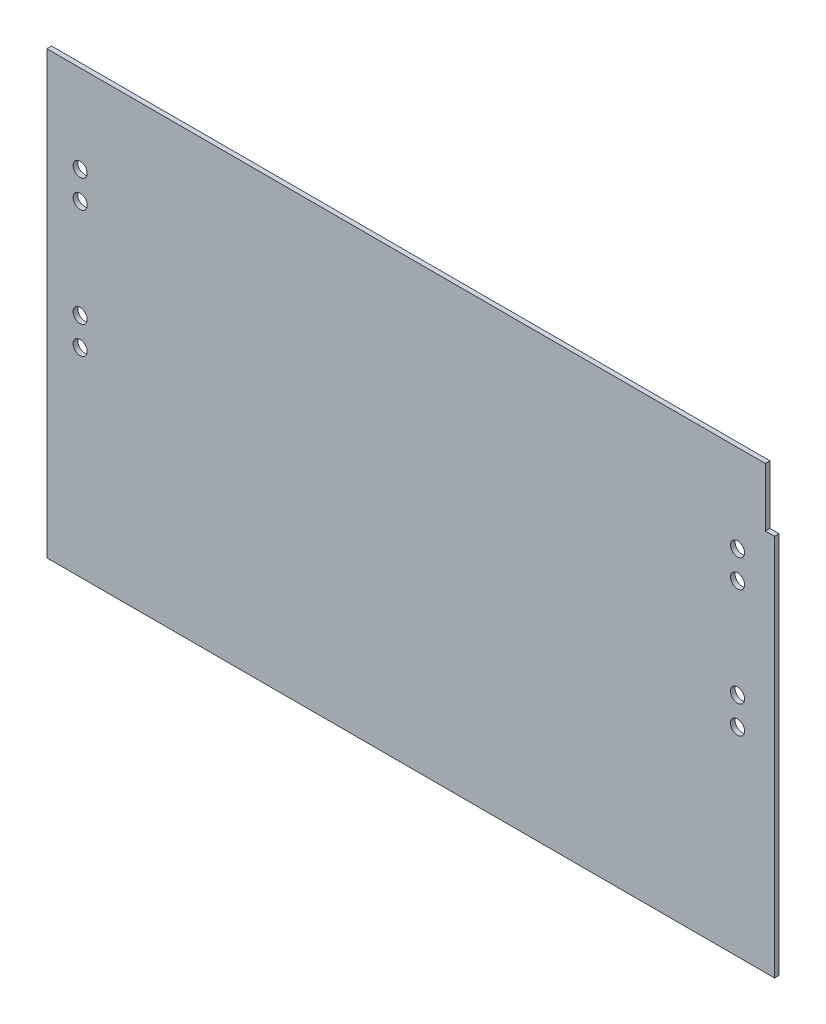
ISO-10303-21;
HEADER;
FILE_DESCRIPTION(('STEP AP214'),'2;1');
FILE_NAME('part.step','',(''),(''),'','','');
FILE_SCHEMA(('AUTOMOTIVE_DESIGN { 1 0 10303 214 1 1 1 1 }'));
ENDSEC;
DATA;
#1=APPLICATION_CONTEXT('core data for automotive mechanical design processes');
#2=APPLICATION_PROTOCOL_DEFINITION('international standard','automotive_design',2000,#1);
#3=PRODUCT_CONTEXT('',#1,'mechanical');
#4=PRODUCT('Part','Part','',(#3));
#5=PRODUCT_RELATED_PRODUCT_CATEGORY('part','',(#4));
#6=PRODUCT_DEFINITION_FORMATION('','',#4);
#7=PRODUCT_DEFINITION_CONTEXT('part definition',#1,'design');
#8=PRODUCT_DEFINITION('design','',#6,#7);
#9=PRODUCT_DEFINITION_SHAPE('','',#8);
#10=(LENGTH_UNIT() NAMED_UNIT(*) SI_UNIT(.MILLI.,.METRE.));
#11=(NAMED_UNIT(*) PLANE_ANGLE_UNIT() SI_UNIT($,.RADIAN.));
#12=(NAMED_UNIT(*) SI_UNIT($,.STERADIAN.) SOLID_ANGLE_UNIT());
#13=UNCERTAINTY_MEASURE_WITH_UNIT(LENGTH_MEASURE(1.E-05),#10,'distance_accuracy_value','');
#14=(GEOMETRIC_REPRESENTATION_CONTEXT(3) GLOBAL_UNCERTAINTY_ASSIGNED_CONTEXT((#13)) GLOBAL_UNIT_ASSIGNED_CONTEXT((#10,
#11,#12)) REPRESENTATION_CONTEXT('',''));
#15=CARTESIAN_POINT('',(0.,0.,0.));
#16=DIRECTION('',(0.,0.,1.));
#17=DIRECTION('',(1.,0.,0.));
#18=AXIS2_PLACEMENT_3D('',#15,#16,#17);
#19=CARTESIAN_POINT('',(0.,0.,3.175));
#20=DIRECTION('',(0.,0.,1.));
#21=DIRECTION('',(1.,0.,0.));
#22=AXIS2_PLACEMENT_3D('',#19,#20,#21);
#23=PLANE('',#22);
#24=CARTESIAN_POINT('',(224.4725,91.1225,3.175));
#25=DIRECTION('',(0.,0.,1.));
#26=DIRECTION('',(1.,0.,0.));
#27=AXIS2_PLACEMENT_3D('',#24,#25,#26);
#28=CIRCLE('',#27,4.82599999999999);
#29=CARTESIAN_POINT('',(229.2985,91.1225,3.175));
#30=VERTEX_POINT('',#29);
#31=EDGE_CURVE('E180',#30,#30,#28,.T.);
#32=ORIENTED_EDGE('',*,*,#31,.F.);
#33=EDGE_LOOP('',(#32));
#34=FACE_BOUND('',#33,.T.);
#35=CARTESIAN_POINT('',(224.4725,-14.9225,3.175));
#36=DIRECTION('',(0.,0.,1.));
#37=DIRECTION('',(1.,0.,0.));
#38=AXIS2_PLACEMENT_3D('',#35,#36,#37);
#39=CIRCLE('',#38,4.82599999999999);
#40=CARTESIAN_POINT('',(229.2985,-14.9225,3.175));
#41=VERTEX_POINT('',#40);
#42=EDGE_CURVE('E168',#41,#41,#39,.T.);
#43=ORIENTED_EDGE('',*,*,#42,.F.);
#44=EDGE_LOOP('',(#43));
#45=FACE_BOUND('',#44,.T.);
#46=CARTESIAN_POINT('',(-227.0125,91.1225,3.175));
#47=DIRECTION('',(0.,0.,1.));
#48=DIRECTION('',(1.,0.,0.));
#49=AXIS2_PLACEMENT_3D('',#46,#47,#48);
#50=CIRCLE('',#49,4.82599999999999);
#51=CARTESIAN_POINT('',(-222.1865,91.1225,3.175));
#52=VERTEX_POINT('',#51);
#53=EDGE_CURVE('E156',#52,#52,#50,.T.);
#54=ORIENTED_EDGE('',*,*,#53,.F.);
#55=EDGE_LOOP('',(#54));
#56=FACE_BOUND('',#55,.T.);
#57=CARTESIAN_POINT('',(-227.0125,-14.9225,3.175));
#58=DIRECTION('',(0.,0.,1.));
#59=DIRECTION('',(1.,0.,0.));
#60=AXIS2_PLACEMENT_3D('',#57,#58,#59);
#61=CIRCLE('',#60,4.82599999999999);
#62=CARTESIAN_POINT('',(-222.1865,-14.9225,3.175));
#63=VERTEX_POINT('',#62);
#64=EDGE_CURVE('E120',#63,#63,#61,.T.);
#65=ORIENTED_EDGE('',*,*,#64,.F.);
#66=EDGE_LOOP('',(#65));
#67=FACE_BOUND('',#66,.T.);
#68=DIRECTION('',(0.,1.,0.));
#69=VECTOR('',#68,1.);
#70=CARTESIAN_POINT('',(249.8725,-151.4475,3.175));
#71=LINE('',#70,#69);
#72=CARTESIAN_POINT('',(249.8725,-151.4475,3.175));
#73=VERTEX_POINT('',#72);
#74=CARTESIAN_POINT('',(249.8725,111.2647,3.175));
#75=VERTEX_POINT('',#74);
#76=EDGE_CURVE('E81',#73,#75,#71,.T.);
#77=ORIENTED_EDGE('',*,*,#76,.T.);
#78=DIRECTION('',(-1.,0.,0.));
#79=VECTOR('',#78,1.);
#80=CARTESIAN_POINT('',(249.8725,111.2647,3.175));
#81=LINE('',#80,#79);
#82=CARTESIAN_POINT('',(243.5225,111.2647,3.175));
#83=VERTEX_POINT('',#82);
#84=EDGE_CURVE('E143',#75,#83,#81,.T.);
#85=ORIENTED_EDGE('',*,*,#84,.T.);
#86=DIRECTION('',(0.,1.,0.));
#87=VECTOR('',#86,1.);
#88=CARTESIAN_POINT('',(243.5225,151.4475,3.175));
#89=LINE('',#88,#87);
#90=CARTESIAN_POINT('',(243.5225,151.4475,3.175));
#91=VERTEX_POINT('',#90);
#92=EDGE_CURVE('E96',#83,#91,#89,.T.);
#93=ORIENTED_EDGE('',*,*,#92,.T.);
#94=DIRECTION('',(-1.,0.,0.));
#95=VECTOR('',#94,1.);
#96=CARTESIAN_POINT('',(-249.8725,151.4475,3.175));
#97=LINE('',#96,#95);
#98=CARTESIAN_POINT('',(-249.8725,151.4475,3.175));
#99=VERTEX_POINT('',#98);
#100=EDGE_CURVE('E89',#91,#99,#97,.T.);
#101=ORIENTED_EDGE('',*,*,#100,.T.);
#102=DIRECTION('',(0.,-1.,0.));
#103=VECTOR('',#102,1.);
#104=CARTESIAN_POINT('',(-249.8725,-120.9675,3.175));
#105=LINE('',#104,#103);
#106=CARTESIAN_POINT('',(-249.8725,-151.4475,3.175));
#107=VERTEX_POINT('',#106);
#108=EDGE_CURVE('E93',#99,#107,#105,.T.);
#109=ORIENTED_EDGE('',*,*,#108,.T.);
#110=DIRECTION('',(1.,0.,0.));
#111=VECTOR('',#110,1.);
#112=CARTESIAN_POINT('',(-249.8725,-151.4475,3.175));
#113=LINE('',#112,#111);
#114=EDGE_CURVE('E50',#107,#73,#113,.T.);
#115=ORIENTED_EDGE('',*,*,#114,.T.);
#116=EDGE_LOOP('',(#77,#85,#93,#101,#109,#115));
#117=FACE_BOUND('',#116,.T.);
#118=CARTESIAN_POINT('',(-227.0125,4.12749999999997,3.175));
#119=DIRECTION('',(0.,0.,1.));
#120=DIRECTION('',(1.,0.,0.));
#121=AXIS2_PLACEMENT_3D('',#118,#119,#120);
#122=CIRCLE('',#121,4.82599999999999);
#123=CARTESIAN_POINT('',(-222.1865,4.12749999999997,3.175));
#124=VERTEX_POINT('',#123);
#125=EDGE_CURVE('E150',#124,#124,#122,.T.);
#126=ORIENTED_EDGE('',*,*,#125,.F.);
#127=EDGE_LOOP('',(#126));
#128=FACE_BOUND('',#127,.T.);
#129=CARTESIAN_POINT('',(-227.0125,72.0725,3.175));
#130=DIRECTION('',(0.,0.,1.));
#131=DIRECTION('',(1.,0.,0.));
#132=AXIS2_PLACEMENT_3D('',#129,#130,#131);
#133=CIRCLE('',#132,4.82599999999999);
#134=CARTESIAN_POINT('',(-222.1865,72.0725,3.175));
#135=VERTEX_POINT('',#134);
#136=EDGE_CURVE('E162',#135,#135,#133,.T.);
#137=ORIENTED_EDGE('',*,*,#136,.F.);
#138=EDGE_LOOP('',(#137));
#139=FACE_BOUND('',#138,.T.);
#140=CARTESIAN_POINT('',(224.4725,4.12749999999997,3.175));
#141=DIRECTION('',(0.,0.,1.));
#142=DIRECTION('',(1.,0.,0.));
#143=AXIS2_PLACEMENT_3D('',#140,#141,#142);
#144=CIRCLE('',#143,4.82599999999999);
#145=CARTESIAN_POINT('',(229.2985,4.12749999999997,3.175));
#146=VERTEX_POINT('',#145);
#147=EDGE_CURVE('E174',#146,#146,#144,.T.);
#148=ORIENTED_EDGE('',*,*,#147,.F.);
#149=EDGE_LOOP('',(#148));
#150=FACE_BOUND('',#149,.T.);
#151=CARTESIAN_POINT('',(224.4725,72.0725,3.175));
#152=DIRECTION('',(0.,0.,1.));
#153=DIRECTION('',(1.,0.,0.));
#154=AXIS2_PLACEMENT_3D('',#151,#152,#153);
#155=CIRCLE('',#154,4.82599999999999);
#156=CARTESIAN_POINT('',(229.2985,72.0725,3.175));
#157=VERTEX_POINT('',#156);
#158=EDGE_CURVE('E186',#157,#157,#155,.T.);
#159=ORIENTED_EDGE('',*,*,#158,.F.);
#160=EDGE_LOOP('',(#159));
#161=FACE_BOUND('',#160,.T.);
#162=ADVANCED_FACE('F33',(#34,#45,#56,#67,#117,#128,#139,#150,#161),#23,.T.);
#163=CARTESIAN_POINT('',(0.,0.,0.));
#164=DIRECTION('',(0.,0.,1.));
#165=DIRECTION('',(1.,0.,0.));
#166=AXIS2_PLACEMENT_3D('',#163,#164,#165);
#167=PLANE('',#166);
#168=DIRECTION('',(0.,1.,0.));
#169=VECTOR('',#168,1.);
#170=CARTESIAN_POINT('',(249.8725,-120.9675,0.));
#171=LINE('',#170,#169);
#172=CARTESIAN_POINT('',(249.8725,-151.4475,0.));
#173=VERTEX_POINT('',#172);
#174=CARTESIAN_POINT('',(249.8725,111.2647,0.));
#175=VERTEX_POINT('',#174);
#176=EDGE_CURVE('E76',#173,#175,#171,.T.);
#177=ORIENTED_EDGE('',*,*,#176,.F.);
#178=DIRECTION('',(1.,0.,0.));
#179=VECTOR('',#178,1.);
#180=CARTESIAN_POINT('',(211.7725,-151.4475,0.));
#181=LINE('',#180,#179);
#182=CARTESIAN_POINT('',(-249.8725,-151.4475,0.));
#183=VERTEX_POINT('',#182);
#184=EDGE_CURVE('E72',#183,#173,#181,.T.);
#185=ORIENTED_EDGE('',*,*,#184,.F.);
#186=DIRECTION('',(0.,-1.,0.));
#187=VECTOR('',#186,1.);
#188=CARTESIAN_POINT('',(-249.8725,-120.9675,0.));
#189=LINE('',#188,#187);
#190=CARTESIAN_POINT('',(-249.8725,151.4475,0.));
#191=VERTEX_POINT('',#190);
#192=EDGE_CURVE('E125',#191,#183,#189,.T.);
#193=ORIENTED_EDGE('',*,*,#192,.F.);
#194=DIRECTION('',(-1.,0.,0.));
#195=VECTOR('',#194,1.);
#196=CARTESIAN_POINT('',(-249.8725,151.4475,0.));
#197=LINE('',#196,#195);
#198=CARTESIAN_POINT('',(243.5225,151.4475,0.));
#199=VERTEX_POINT('',#198);
#200=EDGE_CURVE('E106',#199,#191,#197,.T.);
#201=ORIENTED_EDGE('',*,*,#200,.F.);
#202=DIRECTION('',(0.,1.,0.));
#203=VECTOR('',#202,1.);
#204=CARTESIAN_POINT('',(243.5225,151.4475,0.));
#205=LINE('',#204,#203);
#206=CARTESIAN_POINT('',(243.5225,111.2647,0.));
#207=VERTEX_POINT('',#206);
#208=EDGE_CURVE('E122',#207,#199,#205,.T.);
#209=ORIENTED_EDGE('',*,*,#208,.F.);
#210=DIRECTION('',(-1.,0.,0.));
#211=VECTOR('',#210,1.);
#212=CARTESIAN_POINT('',(249.8725,111.2647,0.));
#213=LINE('',#212,#211);
#214=EDGE_CURVE('E119',#175,#207,#213,.T.);
#215=ORIENTED_EDGE('',*,*,#214,.F.);
#216=EDGE_LOOP('',(#177,#185,#193,#201,#209,#215));
#217=FACE_BOUND('',#216,.T.);
#218=CARTESIAN_POINT('',(-227.0125,-14.9225,0.));
#219=DIRECTION('',(0.,0.,1.));
#220=DIRECTION('',(1.,0.,0.));
#221=AXIS2_PLACEMENT_3D('',#218,#219,#220);
#222=CIRCLE('',#221,4.82599999999999);
#223=CARTESIAN_POINT('',(-222.1865,-14.9225,0.));
#224=VERTEX_POINT('',#223);
#225=EDGE_CURVE('E147',#224,#224,#222,.T.);
#226=ORIENTED_EDGE('',*,*,#225,.T.);
#227=EDGE_LOOP('',(#226));
#228=FACE_BOUND('',#227,.T.);
#229=CARTESIAN_POINT('',(-227.0125,4.12749999999997,0.));
#230=DIRECTION('',(0.,0.,1.));
#231=DIRECTION('',(1.,0.,0.));
#232=AXIS2_PLACEMENT_3D('',#229,#230,#231);
#233=CIRCLE('',#232,4.82599999999999);
#234=CARTESIAN_POINT('',(-222.1865,4.12749999999997,0.));
#235=VERTEX_POINT('',#234);
#236=EDGE_CURVE('E153',#235,#235,#233,.T.);
#237=ORIENTED_EDGE('',*,*,#236,.T.);
#238=EDGE_LOOP('',(#237));
#239=FACE_BOUND('',#238,.T.);
#240=CARTESIAN_POINT('',(-227.0125,91.1225,0.));
#241=DIRECTION('',(0.,0.,1.));
#242=DIRECTION('',(1.,0.,0.));
#243=AXIS2_PLACEMENT_3D('',#240,#241,#242);
#244=CIRCLE('',#243,4.82599999999999);
#245=CARTESIAN_POINT('',(-222.1865,91.1225,0.));
#246=VERTEX_POINT('',#245);
#247=EDGE_CURVE('E159',#246,#246,#244,.T.);
#248=ORIENTED_EDGE('',*,*,#247,.T.);
#249=EDGE_LOOP('',(#248));
#250=FACE_BOUND('',#249,.T.);
#251=CARTESIAN_POINT('',(-227.0125,72.0725,0.));
#252=DIRECTION('',(0.,0.,1.));
#253=DIRECTION('',(1.,0.,0.));
#254=AXIS2_PLACEMENT_3D('',#251,#252,#253);
#255=CIRCLE('',#254,4.82599999999999);
#256=CARTESIAN_POINT('',(-222.1865,72.0725,0.));
#257=VERTEX_POINT('',#256);
#258=EDGE_CURVE('E165',#257,#257,#255,.T.);
#259=ORIENTED_EDGE('',*,*,#258,.T.);
#260=EDGE_LOOP('',(#259));
#261=FACE_BOUND('',#260,.T.);
#262=CARTESIAN_POINT('',(224.4725,-14.9225,0.));
#263=DIRECTION('',(0.,0.,1.));
#264=DIRECTION('',(1.,0.,0.));
#265=AXIS2_PLACEMENT_3D('',#262,#263,#264);
#266=CIRCLE('',#265,4.82599999999999);
#267=CARTESIAN_POINT('',(229.2985,-14.9225,0.));
#268=VERTEX_POINT('',#267);
#269=EDGE_CURVE('E171',#268,#268,#266,.T.);
#270=ORIENTED_EDGE('',*,*,#269,.T.);
#271=EDGE_LOOP('',(#270));
#272=FACE_BOUND('',#271,.T.);
#273=CARTESIAN_POINT('',(224.4725,4.12749999999997,0.));
#274=DIRECTION('',(0.,0.,1.));
#275=DIRECTION('',(1.,0.,0.));
#276=AXIS2_PLACEMENT_3D('',#273,#274,#275);
#277=CIRCLE('',#276,4.82599999999999);
#278=CARTESIAN_POINT('',(229.2985,4.12749999999997,0.));
#279=VERTEX_POINT('',#278);
#280=EDGE_CURVE('E177',#279,#279,#277,.T.);
#281=ORIENTED_EDGE('',*,*,#280,.T.);
#282=EDGE_LOOP('',(#281));
#283=FACE_BOUND('',#282,.T.);
#284=CARTESIAN_POINT('',(224.4725,91.1225,0.));
#285=DIRECTION('',(0.,0.,1.));
#286=DIRECTION('',(1.,0.,0.));
#287=AXIS2_PLACEMENT_3D('',#284,#285,#286);
#288=CIRCLE('',#287,4.82599999999999);
#289=CARTESIAN_POINT('',(229.2985,91.1225,0.));
#290=VERTEX_POINT('',#289);
#291=EDGE_CURVE('E183',#290,#290,#288,.T.);
#292=ORIENTED_EDGE('',*,*,#291,.T.);
#293=EDGE_LOOP('',(#292));
#294=FACE_BOUND('',#293,.T.);
#295=CARTESIAN_POINT('',(224.4725,72.0725,0.));
#296=DIRECTION('',(0.,0.,1.));
#297=DIRECTION('',(1.,0.,0.));
#298=AXIS2_PLACEMENT_3D('',#295,#296,#297);
#299=CIRCLE('',#298,4.82599999999999);
#300=CARTESIAN_POINT('',(229.2985,72.0725,0.));
#301=VERTEX_POINT('',#300);
#302=EDGE_CURVE('E189',#301,#301,#299,.T.);
#303=ORIENTED_EDGE('',*,*,#302,.T.);
#304=EDGE_LOOP('',(#303));
#305=FACE_BOUND('',#304,.T.);
#306=ADVANCED_FACE('F138',(#217,#228,#239,#250,#261,#272,#283,#294,#305),#167,.F.);
#307=CARTESIAN_POINT('',(249.8725,-120.9675,3.175));
#308=DIRECTION('',(-1.,0.,0.));
#309=DIRECTION('',(0.,0.,1.));
#310=AXIS2_PLACEMENT_3D('',#307,#308,#309);
#311=PLANE('',#310);
#312=ORIENTED_EDGE('',*,*,#176,.T.);
#313=DIRECTION('',(0.,0.,-1.));
#314=VECTOR('',#313,1.);
#315=CARTESIAN_POINT('',(249.8725,111.2647,3.175));
#316=LINE('',#315,#314);
#317=EDGE_CURVE('E11',#75,#175,#316,.T.);
#318=ORIENTED_EDGE('',*,*,#317,.F.);
#319=ORIENTED_EDGE('',*,*,#76,.F.);
#320=DIRECTION('',(0.,0.,-1.));
#321=VECTOR('',#320,1.);
#322=CARTESIAN_POINT('',(249.8725,-151.4475,3.175));
#323=LINE('',#322,#321);
#324=EDGE_CURVE('E114',#73,#173,#323,.T.);
#325=ORIENTED_EDGE('',*,*,#324,.T.);
#326=EDGE_LOOP('',(#312,#318,#319,#325));
#327=FACE_BOUND('',#326,.T.);
#328=ADVANCED_FACE('F35',(#327),#311,.F.);
#329=CARTESIAN_POINT('',(249.8725,111.2647,3.175));
#330=DIRECTION('',(0.,-1.,0.));
#331=DIRECTION('',(0.,0.,-1.));
#332=AXIS2_PLACEMENT_3D('',#329,#330,#331);
#333=PLANE('',#332);
#334=ORIENTED_EDGE('',*,*,#214,.T.);
#335=DIRECTION('',(0.,0.,-1.));
#336=VECTOR('',#335,1.);
#337=CARTESIAN_POINT('',(243.5225,111.2647,3.175));
#338=LINE('',#337,#336);
#339=EDGE_CURVE('E42',#83,#207,#338,.T.);
#340=ORIENTED_EDGE('',*,*,#339,.F.);
#341=ORIENTED_EDGE('',*,*,#84,.F.);
#342=ORIENTED_EDGE('',*,*,#317,.T.);
#343=EDGE_LOOP('',(#334,#340,#341,#342));
#344=FACE_BOUND('',#343,.T.);
#345=ADVANCED_FACE('F218',(#344),#333,.F.);
#346=CARTESIAN_POINT('',(243.5225,151.4475,3.175));
#347=DIRECTION('',(-1.,0.,0.));
#348=DIRECTION('',(0.,-1.,0.));
#349=AXIS2_PLACEMENT_3D('',#346,#347,#348);
#350=PLANE('',#349);
#351=ORIENTED_EDGE('',*,*,#208,.T.);
#352=DIRECTION('',(0.,0.,-1.));
#353=VECTOR('',#352,1.);
#354=CARTESIAN_POINT('',(243.5225,151.4475,3.175));
#355=LINE('',#354,#353);
#356=EDGE_CURVE('E108',#91,#199,#355,.T.);
#357=ORIENTED_EDGE('',*,*,#356,.F.);
#358=ORIENTED_EDGE('',*,*,#92,.F.);
#359=ORIENTED_EDGE('',*,*,#339,.T.);
#360=EDGE_LOOP('',(#351,#357,#358,#359));
#361=FACE_BOUND('',#360,.T.);
#362=ADVANCED_FACE('F135',(#361),#350,.F.);
#363=CARTESIAN_POINT('',(-249.8725,151.4475,3.175));
#364=DIRECTION('',(0.,-1.,0.));
#365=DIRECTION('',(0.,0.,-1.));
#366=AXIS2_PLACEMENT_3D('',#363,#364,#365);
#367=PLANE('',#366);
#368=ORIENTED_EDGE('',*,*,#200,.T.);
#369=DIRECTION('',(0.,0.,-1.));
#370=VECTOR('',#369,1.);
#371=CARTESIAN_POINT('',(-249.8725,151.4475,3.175));
#372=LINE('',#371,#370);
#373=EDGE_CURVE('E103',#99,#191,#372,.T.);
#374=ORIENTED_EDGE('',*,*,#373,.F.);
#375=ORIENTED_EDGE('',*,*,#100,.F.);
#376=ORIENTED_EDGE('',*,*,#356,.T.);
#377=EDGE_LOOP('',(#368,#374,#375,#376));
#378=FACE_BOUND('',#377,.T.);
#379=ADVANCED_FACE('F104',(#378),#367,.F.);
#380=CARTESIAN_POINT('',(-249.8725,-120.9675,3.175));
#381=DIRECTION('',(1.,0.,0.));
#382=DIRECTION('',(0.,0.,-1.));
#383=AXIS2_PLACEMENT_3D('',#380,#381,#382);
#384=PLANE('',#383);
#385=ORIENTED_EDGE('',*,*,#192,.T.);
#386=DIRECTION('',(0.,0.,-1.));
#387=VECTOR('',#386,1.);
#388=CARTESIAN_POINT('',(-249.8725,-151.4475,3.175));
#389=LINE('',#388,#387);
#390=EDGE_CURVE('E109',#107,#183,#389,.T.);
#391=ORIENTED_EDGE('',*,*,#390,.F.);
#392=ORIENTED_EDGE('',*,*,#108,.F.);
#393=ORIENTED_EDGE('',*,*,#373,.T.);
#394=EDGE_LOOP('',(#385,#391,#392,#393));
#395=FACE_BOUND('',#394,.T.);
#396=ADVANCED_FACE('F111',(#395),#384,.F.);
#397=CARTESIAN_POINT('',(211.7725,-151.4475,3.175));
#398=DIRECTION('',(0.,1.,0.));
#399=DIRECTION('',(0.,0.,1.));
#400=AXIS2_PLACEMENT_3D('',#397,#398,#399);
#401=PLANE('',#400);
#402=ORIENTED_EDGE('',*,*,#184,.T.);
#403=ORIENTED_EDGE('',*,*,#324,.F.);
#404=ORIENTED_EDGE('',*,*,#114,.F.);
#405=ORIENTED_EDGE('',*,*,#390,.T.);
#406=EDGE_LOOP('',(#402,#403,#404,#405));
#407=FACE_BOUND('',#406,.T.);
#408=ADVANCED_FACE('F141',(#407),#401,.F.);
#409=CARTESIAN_POINT('',(-227.0125,-14.9225,3.175));
#410=DIRECTION('',(0.,0.,-1.));
#411=DIRECTION('',(-1.,0.,0.));
#412=AXIS2_PLACEMENT_3D('',#409,#410,#411);
#413=CYLINDRICAL_SURFACE('',#412,4.82599999999999);
#414=ORIENTED_EDGE('',*,*,#64,.T.);
#415=EDGE_LOOP('',(#414));
#416=FACE_BOUND('',#415,.T.);
#417=ORIENTED_EDGE('',*,*,#225,.F.);
#418=EDGE_LOOP('',(#417));
#419=FACE_BOUND('',#418,.T.);
#420=ADVANCED_FACE('F208',(#416,#419),#413,.F.);
#421=CARTESIAN_POINT('',(-227.0125,4.12749999999997,3.175));
#422=DIRECTION('',(0.,0.,-1.));
#423=DIRECTION('',(-1.,0.,0.));
#424=AXIS2_PLACEMENT_3D('',#421,#422,#423);
#425=CYLINDRICAL_SURFACE('',#424,4.82599999999999);
#426=ORIENTED_EDGE('',*,*,#125,.T.);
#427=EDGE_LOOP('',(#426));
#428=FACE_BOUND('',#427,.T.);
#429=ORIENTED_EDGE('',*,*,#236,.F.);
#430=EDGE_LOOP('',(#429));
#431=FACE_BOUND('',#430,.T.);
#432=ADVANCED_FACE('F281',(#428,#431),#425,.F.);
#433=CARTESIAN_POINT('',(-227.0125,91.1225,3.175));
#434=DIRECTION('',(0.,0.,-1.));
#435=DIRECTION('',(-1.,0.,0.));
#436=AXIS2_PLACEMENT_3D('',#433,#434,#435);
#437=CYLINDRICAL_SURFACE('',#436,4.82599999999999);
#438=ORIENTED_EDGE('',*,*,#53,.T.);
#439=EDGE_LOOP('',(#438));
#440=FACE_BOUND('',#439,.T.);
#441=ORIENTED_EDGE('',*,*,#247,.F.);
#442=EDGE_LOOP('',(#441));
#443=FACE_BOUND('',#442,.T.);
#444=ADVANCED_FACE('F289',(#440,#443),#437,.F.);
#445=CARTESIAN_POINT('',(-227.0125,72.0725,3.175));
#446=DIRECTION('',(0.,0.,-1.));
#447=DIRECTION('',(-1.,0.,0.));
#448=AXIS2_PLACEMENT_3D('',#445,#446,#447);
#449=CYLINDRICAL_SURFACE('',#448,4.82599999999999);
#450=ORIENTED_EDGE('',*,*,#136,.T.);
#451=EDGE_LOOP('',(#450));
#452=FACE_BOUND('',#451,.T.);
#453=ORIENTED_EDGE('',*,*,#258,.F.);
#454=EDGE_LOOP('',(#453));
#455=FACE_BOUND('',#454,.T.);
#456=ADVANCED_FACE('F297',(#452,#455),#449,.F.);
#457=CARTESIAN_POINT('',(224.4725,-14.9225,3.175));
#458=DIRECTION('',(0.,0.,-1.));
#459=DIRECTION('',(-1.,0.,0.));
#460=AXIS2_PLACEMENT_3D('',#457,#458,#459);
#461=CYLINDRICAL_SURFACE('',#460,4.82599999999999);
#462=ORIENTED_EDGE('',*,*,#42,.T.);
#463=EDGE_LOOP('',(#462));
#464=FACE_BOUND('',#463,.T.);
#465=ORIENTED_EDGE('',*,*,#269,.F.);
#466=EDGE_LOOP('',(#465));
#467=FACE_BOUND('',#466,.T.);
#468=ADVANCED_FACE('F306',(#464,#467),#461,.F.);
#469=CARTESIAN_POINT('',(224.4725,4.12749999999997,3.175));
#470=DIRECTION('',(0.,0.,-1.));
#471=DIRECTION('',(-1.,0.,0.));
#472=AXIS2_PLACEMENT_3D('',#469,#470,#471);
#473=CYLINDRICAL_SURFACE('',#472,4.82599999999999);
#474=ORIENTED_EDGE('',*,*,#147,.T.);
#475=EDGE_LOOP('',(#474));
#476=FACE_BOUND('',#475,.T.);
#477=ORIENTED_EDGE('',*,*,#280,.F.);
#478=EDGE_LOOP('',(#477));
#479=FACE_BOUND('',#478,.T.);
#480=ADVANCED_FACE('F315',(#476,#479),#473,.F.);
#481=CARTESIAN_POINT('',(224.4725,91.1225,3.175));
#482=DIRECTION('',(0.,0.,-1.));
#483=DIRECTION('',(-1.,0.,0.));
#484=AXIS2_PLACEMENT_3D('',#481,#482,#483);
#485=CYLINDRICAL_SURFACE('',#484,4.82599999999999);
#486=ORIENTED_EDGE('',*,*,#31,.T.);
#487=EDGE_LOOP('',(#486));
#488=FACE_BOUND('',#487,.T.);
#489=ORIENTED_EDGE('',*,*,#291,.F.);
#490=EDGE_LOOP('',(#489));
#491=FACE_BOUND('',#490,.T.);
#492=ADVANCED_FACE('F324',(#488,#491),#485,.F.);
#493=CARTESIAN_POINT('',(224.4725,72.0725,3.175));
#494=DIRECTION('',(0.,0.,-1.));
#495=DIRECTION('',(-1.,0.,0.));
#496=AXIS2_PLACEMENT_3D('',#493,#494,#495);
#497=CYLINDRICAL_SURFACE('',#496,4.82599999999999);
#498=ORIENTED_EDGE('',*,*,#158,.T.);
#499=EDGE_LOOP('',(#498));
#500=FACE_BOUND('',#499,.T.);
#501=ORIENTED_EDGE('',*,*,#302,.F.);
#502=EDGE_LOOP('',(#501));
#503=FACE_BOUND('',#502,.T.);
#504=ADVANCED_FACE('F195',(#500,#503),#497,.F.);
#505=CLOSED_SHELL('',(#162,#306,#328,#345,#362,#379,#396,#408,#420,#432,#444,#456,#468,#480,
#492,#504));
#506=MANIFOLD_SOLID_BREP('B2',#505);
#507=ADVANCED_BREP_SHAPE_REPRESENTATION('',(#18,#506),#14);
#508=SHAPE_DEFINITION_REPRESENTATION(#9,#507);
ENDSEC;
END-ISO-10303-21;
